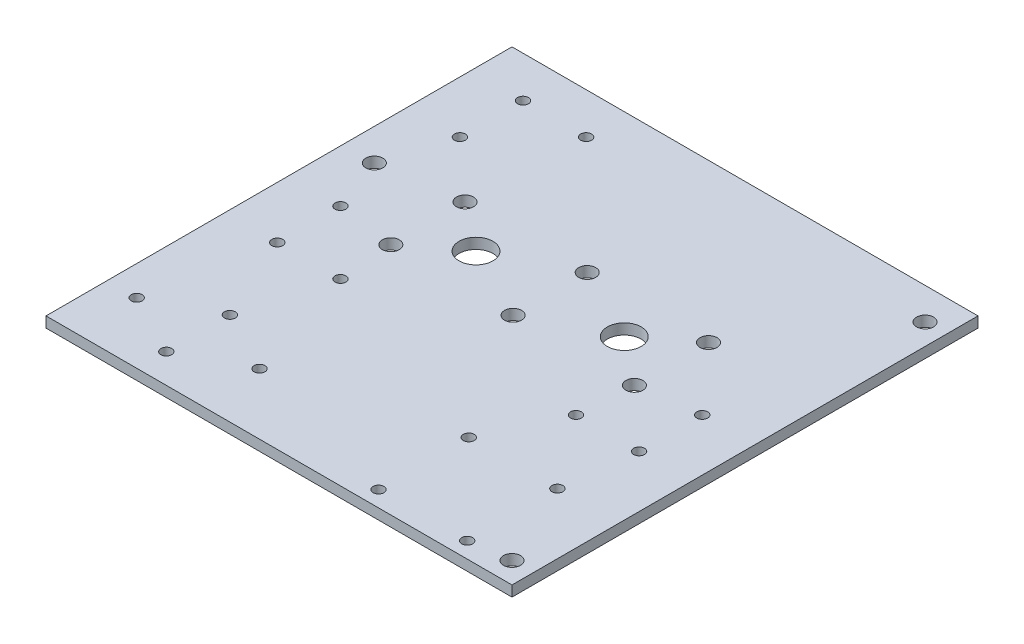
ISO-10303-21;
HEADER;
FILE_DESCRIPTION(('STEP AP214'),'2;1');
FILE_NAME('part.step','',(''),(''),'','','');
FILE_SCHEMA(('AUTOMOTIVE_DESIGN { 1 0 10303 214 1 1 1 1 }'));
ENDSEC;
DATA;
#1=APPLICATION_CONTEXT('core data for automotive mechanical design processes');
#2=APPLICATION_PROTOCOL_DEFINITION('international standard','automotive_design',2000,#1);
#3=PRODUCT_CONTEXT('',#1,'mechanical');
#4=PRODUCT('Part','Part','',(#3));
#5=PRODUCT_RELATED_PRODUCT_CATEGORY('part','',(#4));
#6=PRODUCT_DEFINITION_FORMATION('','',#4);
#7=PRODUCT_DEFINITION_CONTEXT('part definition',#1,'design');
#8=PRODUCT_DEFINITION('design','',#6,#7);
#9=PRODUCT_DEFINITION_SHAPE('','',#8);
#10=(LENGTH_UNIT() NAMED_UNIT(*) SI_UNIT(.MILLI.,.METRE.));
#11=(NAMED_UNIT(*) PLANE_ANGLE_UNIT() SI_UNIT($,.RADIAN.));
#12=(NAMED_UNIT(*) SI_UNIT($,.STERADIAN.) SOLID_ANGLE_UNIT());
#13=UNCERTAINTY_MEASURE_WITH_UNIT(LENGTH_MEASURE(1.E-05),#10,'distance_accuracy_value','');
#14=(GEOMETRIC_REPRESENTATION_CONTEXT(3) GLOBAL_UNCERTAINTY_ASSIGNED_CONTEXT((#13)) GLOBAL_UNIT_ASSIGNED_CONTEXT((#10,
#11,#12)) REPRESENTATION_CONTEXT('',''));
#15=CARTESIAN_POINT('',(0.,0.,0.));
#16=DIRECTION('',(0.,0.,1.));
#17=DIRECTION('',(1.,0.,0.));
#18=AXIS2_PLACEMENT_3D('',#15,#16,#17);
#19=CARTESIAN_POINT('',(0.,3.175,0.));
#20=DIRECTION('',(0.,-1.,0.));
#21=DIRECTION('',(0.,0.,-1.));
#22=AXIS2_PLACEMENT_3D('',#19,#20,#21);
#23=PLANE('',#22);
#24=CARTESIAN_POINT('',(-35.306,3.175,-57.531));
#25=DIRECTION('',(0.,1.,0.));
#26=DIRECTION('',(0.,0.,1.));
#27=AXIS2_PLACEMENT_3D('',#24,#25,#26);
#28=CIRCLE('',#27,1.63195);
#29=CARTESIAN_POINT('',(-35.306,3.175,-55.89905));
#30=VERTEX_POINT('',#29);
#31=EDGE_CURVE('E507',#30,#30,#28,.T.);
#32=ORIENTED_EDGE('',*,*,#31,.F.);
#33=EDGE_LOOP('',(#32));
#34=FACE_BOUND('',#33,.T.);
#35=CARTESIAN_POINT('',(-54.229,3.175,-57.531));
#36=DIRECTION('',(0.,1.,0.));
#37=DIRECTION('',(0.,0.,1.));
#38=AXIS2_PLACEMENT_3D('',#35,#36,#37);
#39=CIRCLE('',#38,1.63195);
#40=CARTESIAN_POINT('',(-54.229,3.175,-55.89905));
#41=VERTEX_POINT('',#40);
#42=EDGE_CURVE('E509',#41,#41,#39,.T.);
#43=ORIENTED_EDGE('',*,*,#42,.F.);
#44=EDGE_LOOP('',(#43));
#45=FACE_BOUND('',#44,.T.);
#46=CARTESIAN_POINT('',(-54.229,3.175,-38.608));
#47=DIRECTION('',(0.,1.,0.));
#48=DIRECTION('',(0.,0.,1.));
#49=AXIS2_PLACEMENT_3D('',#46,#47,#48);
#50=CIRCLE('',#49,1.63195);
#51=CARTESIAN_POINT('',(-54.229,3.175,-36.97605));
#52=VERTEX_POINT('',#51);
#53=EDGE_CURVE('E517',#52,#52,#50,.T.);
#54=ORIENTED_EDGE('',*,*,#53,.F.);
#55=EDGE_LOOP('',(#54));
#56=FACE_BOUND('',#55,.T.);
#57=CARTESIAN_POINT('',(-54.229,3.175,-2.79400000000001));
#58=DIRECTION('',(0.,1.,0.));
#59=DIRECTION('',(0.,0.,1.));
#60=AXIS2_PLACEMENT_3D('',#57,#58,#59);
#61=CIRCLE('',#60,1.63195);
#62=CARTESIAN_POINT('',(-54.229,3.175,-1.16205000000001));
#63=VERTEX_POINT('',#62);
#64=EDGE_CURVE('E520',#63,#63,#61,.T.);
#65=ORIENTED_EDGE('',*,*,#64,.F.);
#66=EDGE_LOOP('',(#65));
#67=FACE_BOUND('',#66,.T.);
#68=CARTESIAN_POINT('',(-54.229,3.175,16.129));
#69=DIRECTION('',(0.,1.,0.));
#70=DIRECTION('',(0.,0.,1.));
#71=AXIS2_PLACEMENT_3D('',#68,#69,#70);
#72=CIRCLE('',#71,1.63195);
#73=CARTESIAN_POINT('',(-54.229,3.175,17.76095));
#74=VERTEX_POINT('',#73);
#75=EDGE_CURVE('E526',#74,#74,#72,.T.);
#76=ORIENTED_EDGE('',*,*,#75,.F.);
#77=EDGE_LOOP('',(#76));
#78=FACE_BOUND('',#77,.T.);
#79=CARTESIAN_POINT('',(-35.306,3.175,16.129));
#80=DIRECTION('',(0.,1.,0.));
#81=DIRECTION('',(0.,0.,1.));
#82=AXIS2_PLACEMENT_3D('',#79,#80,#81);
#83=CIRCLE('',#82,1.63195);
#84=CARTESIAN_POINT('',(-35.306,3.175,17.76095));
#85=VERTEX_POINT('',#84);
#86=EDGE_CURVE('E532',#85,#85,#83,.T.);
#87=ORIENTED_EDGE('',*,*,#86,.F.);
#88=EDGE_LOOP('',(#87));
#89=FACE_BOUND('',#88,.T.);
#90=CARTESIAN_POINT('',(35.306,3.175,16.129));
#91=DIRECTION('',(0.,1.,0.));
#92=DIRECTION('',(0.,0.,1.));
#93=AXIS2_PLACEMENT_3D('',#90,#91,#92);
#94=CIRCLE('',#93,1.63195);
#95=CARTESIAN_POINT('',(35.306,3.175,17.76095));
#96=VERTEX_POINT('',#95);
#97=EDGE_CURVE('E538',#96,#96,#94,.T.);
#98=ORIENTED_EDGE('',*,*,#97,.F.);
#99=EDGE_LOOP('',(#98));
#100=FACE_BOUND('',#99,.T.);
#101=CARTESIAN_POINT('',(54.229,3.175,16.129));
#102=DIRECTION('',(0.,1.,0.));
#103=DIRECTION('',(0.,0.,1.));
#104=AXIS2_PLACEMENT_3D('',#101,#102,#103);
#105=CIRCLE('',#104,1.63195);
#106=CARTESIAN_POINT('',(54.229,3.175,17.76095));
#107=VERTEX_POINT('',#106);
#108=EDGE_CURVE('E544',#107,#107,#105,.T.);
#109=ORIENTED_EDGE('',*,*,#108,.F.);
#110=EDGE_LOOP('',(#109));
#111=FACE_BOUND('',#110,.T.);
#112=CARTESIAN_POINT('',(54.229,3.175,-2.79400000000001));
#113=DIRECTION('',(0.,1.,0.));
#114=DIRECTION('',(0.,0.,1.));
#115=AXIS2_PLACEMENT_3D('',#112,#113,#114);
#116=CIRCLE('',#115,1.63195);
#117=CARTESIAN_POINT('',(54.229,3.175,-1.16205000000001));
#118=VERTEX_POINT('',#117);
#119=EDGE_CURVE('E550',#118,#118,#116,.T.);
#120=ORIENTED_EDGE('',*,*,#119,.F.);
#121=EDGE_LOOP('',(#120));
#122=FACE_BOUND('',#121,.T.);
#123=CARTESIAN_POINT('',(-36.6395,3.175,-22.5425));
#124=DIRECTION('',(0.,1.,0.));
#125=DIRECTION('',(0.,0.,1.));
#126=AXIS2_PLACEMENT_3D('',#123,#124,#125);
#127=CIRCLE('',#126,2.5527);
#128=CARTESIAN_POINT('',(-36.6395,3.175,-19.9898));
#129=VERTEX_POINT('',#128);
#130=EDGE_CURVE('E556',#129,#129,#127,.T.);
#131=ORIENTED_EDGE('',*,*,#130,.F.);
#132=EDGE_LOOP('',(#131));
#133=FACE_BOUND('',#132,.T.);
#134=CARTESIAN_POINT('',(36.3855,3.175,-22.5425));
#135=DIRECTION('',(0.,1.,0.));
#136=DIRECTION('',(0.,0.,1.));
#137=AXIS2_PLACEMENT_3D('',#134,#135,#136);
#138=CIRCLE('',#137,2.5527);
#139=CARTESIAN_POINT('',(36.3855,3.175,-19.9898));
#140=VERTEX_POINT('',#139);
#141=EDGE_CURVE('E562',#140,#140,#138,.T.);
#142=ORIENTED_EDGE('',*,*,#141,.F.);
#143=EDGE_LOOP('',(#142));
#144=FACE_BOUND('',#143,.T.);
#145=CARTESIAN_POINT('',(36.3855,3.175,-0.317499999999998));
#146=DIRECTION('',(0.,1.,0.));
#147=DIRECTION('',(0.,0.,1.));
#148=AXIS2_PLACEMENT_3D('',#145,#146,#147);
#149=CIRCLE('',#148,2.5527);
#150=CARTESIAN_POINT('',(36.3855,3.175,2.2352));
#151=VERTEX_POINT('',#150);
#152=EDGE_CURVE('E568',#151,#151,#149,.T.);
#153=ORIENTED_EDGE('',*,*,#152,.F.);
#154=EDGE_LOOP('',(#153));
#155=FACE_BOUND('',#154,.T.);
#156=CARTESIAN_POINT('',(-36.6395,3.175,-0.317499999999998));
#157=DIRECTION('',(0.,1.,0.));
#158=DIRECTION('',(0.,0.,1.));
#159=AXIS2_PLACEMENT_3D('',#156,#157,#158);
#160=CIRCLE('',#159,2.5527);
#161=CARTESIAN_POINT('',(-36.6395,3.175,2.2352));
#162=VERTEX_POINT('',#161);
#163=EDGE_CURVE('E574',#162,#162,#160,.T.);
#164=ORIENTED_EDGE('',*,*,#163,.F.);
#165=EDGE_LOOP('',(#164));
#166=FACE_BOUND('',#165,.T.);
#167=CARTESIAN_POINT('',(0.,3.175,-0.317499999999998));
#168=DIRECTION('',(0.,1.,0.));
#169=DIRECTION('',(0.,0.,1.));
#170=AXIS2_PLACEMENT_3D('',#167,#168,#169);
#171=CIRCLE('',#170,2.5527);
#172=CARTESIAN_POINT('',(0.,3.175,2.2352));
#173=VERTEX_POINT('',#172);
#174=EDGE_CURVE('E580',#173,#173,#171,.T.);
#175=ORIENTED_EDGE('',*,*,#174,.F.);
#176=EDGE_LOOP('',(#175));
#177=FACE_BOUND('',#176,.T.);
#178=CARTESIAN_POINT('',(0.,3.175,-22.5425));
#179=DIRECTION('',(0.,1.,0.));
#180=DIRECTION('',(0.,0.,1.));
#181=AXIS2_PLACEMENT_3D('',#178,#179,#180);
#182=CIRCLE('',#181,2.5527);
#183=CARTESIAN_POINT('',(0.,3.175,-19.9898));
#184=VERTEX_POINT('',#183);
#185=EDGE_CURVE('E142',#184,#184,#182,.T.);
#186=ORIENTED_EDGE('',*,*,#185,.F.);
#187=EDGE_LOOP('',(#186));
#188=FACE_BOUND('',#187,.T.);
#189=CARTESIAN_POINT('',(25.0825,3.175,38.0365));
#190=DIRECTION('',(0.,1.,0.));
#191=DIRECTION('',(0.,0.,1.));
#192=AXIS2_PLACEMENT_3D('',#189,#190,#191);
#193=CIRCLE('',#192,1.63195);
#194=CARTESIAN_POINT('',(25.0825,3.175,39.66845));
#195=VERTEX_POINT('',#194);
#196=EDGE_CURVE('E130',#195,#195,#193,.T.);
#197=ORIENTED_EDGE('',*,*,#196,.F.);
#198=EDGE_LOOP('',(#197));
#199=FACE_BOUND('',#198,.T.);
#200=CARTESIAN_POINT('',(51.6509,3.175,38.0365));
#201=DIRECTION('',(0.,1.,0.));
#202=DIRECTION('',(0.,0.,1.));
#203=AXIS2_PLACEMENT_3D('',#200,#201,#202);
#204=CIRCLE('',#203,1.63195);
#205=CARTESIAN_POINT('',(51.6509,3.175,39.66845));
#206=VERTEX_POINT('',#205);
#207=EDGE_CURVE('E129',#206,#206,#204,.T.);
#208=ORIENTED_EDGE('',*,*,#207,.F.);
#209=EDGE_LOOP('',(#208));
#210=FACE_BOUND('',#209,.T.);
#211=CARTESIAN_POINT('',(25.0825,3.175,65.0875));
#212=DIRECTION('',(0.,1.,0.));
#213=DIRECTION('',(0.,0.,1.));
#214=AXIS2_PLACEMENT_3D('',#211,#212,#213);
#215=CIRCLE('',#214,1.63195);
#216=CARTESIAN_POINT('',(25.0825,3.175,66.71945));
#217=VERTEX_POINT('',#216);
#218=EDGE_CURVE('E126',#217,#217,#215,.T.);
#219=ORIENTED_EDGE('',*,*,#218,.F.);
#220=EDGE_LOOP('',(#219));
#221=FACE_BOUND('',#220,.T.);
#222=CARTESIAN_POINT('',(51.6509,3.175,65.0875));
#223=DIRECTION('',(0.,1.,0.));
#224=DIRECTION('',(0.,0.,1.));
#225=AXIS2_PLACEMENT_3D('',#222,#223,#224);
#226=CIRCLE('',#225,1.63195);
#227=CARTESIAN_POINT('',(51.6509,3.175,66.71945));
#228=VERTEX_POINT('',#227);
#229=EDGE_CURVE('E125',#228,#228,#226,.T.);
#230=ORIENTED_EDGE('',*,*,#229,.F.);
#231=EDGE_LOOP('',(#230));
#232=FACE_BOUND('',#231,.T.);
#233=CARTESIAN_POINT('',(-42.545,3.175,42.037));
#234=DIRECTION('',(0.,1.,0.));
#235=DIRECTION('',(0.,0.,1.));
#236=AXIS2_PLACEMENT_3D('',#233,#234,#235);
#237=CIRCLE('',#236,1.63195);
#238=CARTESIAN_POINT('',(-42.545,3.175,43.66895));
#239=VERTEX_POINT('',#238);
#240=EDGE_CURVE('E121',#239,#239,#237,.T.);
#241=ORIENTED_EDGE('',*,*,#240,.F.);
#242=EDGE_LOOP('',(#241));
#243=FACE_BOUND('',#242,.T.);
#244=CARTESIAN_POINT('',(-24.13,3.175,51.562));
#245=DIRECTION('',(0.,1.,0.));
#246=DIRECTION('',(0.,0.,1.));
#247=AXIS2_PLACEMENT_3D('',#244,#245,#246);
#248=CIRCLE('',#247,1.63195);
#249=CARTESIAN_POINT('',(-24.13,3.175,53.19395));
#250=VERTEX_POINT('',#249);
#251=EDGE_CURVE('E117',#250,#250,#248,.T.);
#252=ORIENTED_EDGE('',*,*,#251,.F.);
#253=EDGE_LOOP('',(#252));
#254=FACE_BOUND('',#253,.T.);
#255=CARTESIAN_POINT('',(-42.545,3.175,61.087));
#256=DIRECTION('',(0.,1.,0.));
#257=DIRECTION('',(0.,0.,1.));
#258=AXIS2_PLACEMENT_3D('',#255,#256,#257);
#259=CIRCLE('',#258,1.63195);
#260=CARTESIAN_POINT('',(-42.545,3.175,62.71895));
#261=VERTEX_POINT('',#260);
#262=EDGE_CURVE('E116',#261,#261,#259,.T.);
#263=ORIENTED_EDGE('',*,*,#262,.F.);
#264=EDGE_LOOP('',(#263));
#265=FACE_BOUND('',#264,.T.);
#266=CARTESIAN_POINT('',(63.5,3.175,63.5));
#267=DIRECTION('',(0.,1.,0.));
#268=DIRECTION('',(0.,0.,1.));
#269=AXIS2_PLACEMENT_3D('',#266,#267,#268);
#270=CIRCLE('',#269,2.55269999999999);
#271=CARTESIAN_POINT('',(63.5,3.175,66.0527));
#272=VERTEX_POINT('',#271);
#273=EDGE_CURVE('E169',#272,#272,#270,.T.);
#274=ORIENTED_EDGE('',*,*,#273,.F.);
#275=EDGE_LOOP('',(#274));
#276=FACE_BOUND('',#275,.T.);
#277=CARTESIAN_POINT('',(-60.325,3.175,-19.05));
#278=DIRECTION('',(0.,1.,0.));
#279=DIRECTION('',(0.,0.,1.));
#280=AXIS2_PLACEMENT_3D('',#277,#278,#279);
#281=CIRCLE('',#280,2.55269999999998);
#282=CARTESIAN_POINT('',(-60.325,3.175,-16.4973));
#283=VERTEX_POINT('',#282);
#284=EDGE_CURVE('E175',#283,#283,#281,.T.);
#285=ORIENTED_EDGE('',*,*,#284,.F.);
#286=EDGE_LOOP('',(#285));
#287=FACE_BOUND('',#286,.T.);
#288=CARTESIAN_POINT('',(63.5,3.175,-60.325));
#289=DIRECTION('',(0.,1.,0.));
#290=DIRECTION('',(0.,0.,1.));
#291=AXIS2_PLACEMENT_3D('',#288,#289,#290);
#292=CIRCLE('',#291,2.55269999999999);
#293=CARTESIAN_POINT('',(63.5,3.175,-57.7723));
#294=VERTEX_POINT('',#293);
#295=EDGE_CURVE('E181',#294,#294,#292,.T.);
#296=ORIENTED_EDGE('',*,*,#295,.F.);
#297=EDGE_LOOP('',(#296));
#298=FACE_BOUND('',#297,.T.);
#299=CARTESIAN_POINT('',(22.225,3.175,-11.43));
#300=DIRECTION('',(0.,1.,0.));
#301=DIRECTION('',(0.,0.,1.));
#302=AXIS2_PLACEMENT_3D('',#299,#300,#301);
#303=CIRCLE('',#302,5.08);
#304=CARTESIAN_POINT('',(22.225,3.175,-6.35));
#305=VERTEX_POINT('',#304);
#306=EDGE_CURVE('E187',#305,#305,#303,.T.);
#307=ORIENTED_EDGE('',*,*,#306,.F.);
#308=EDGE_LOOP('',(#307));
#309=FACE_BOUND('',#308,.T.);
#310=CARTESIAN_POINT('',(-22.225,3.175,-11.43));
#311=DIRECTION('',(0.,1.,0.));
#312=DIRECTION('',(0.,0.,1.));
#313=AXIS2_PLACEMENT_3D('',#310,#311,#312);
#314=CIRCLE('',#313,5.08);
#315=CARTESIAN_POINT('',(-22.225,3.175,-6.34999999999999));
#316=VERTEX_POINT('',#315);
#317=EDGE_CURVE('E191',#316,#316,#314,.T.);
#318=ORIENTED_EDGE('',*,*,#317,.F.);
#319=EDGE_LOOP('',(#318));
#320=FACE_BOUND('',#319,.T.);
#321=DIRECTION('',(0.,0.,-1.));
#322=VECTOR('',#321,1.);
#323=CARTESIAN_POINT('',(-69.85,3.175,69.85));
#324=LINE('',#323,#322);
#325=CARTESIAN_POINT('',(-69.85,3.175,69.85));
#326=VERTEX_POINT('',#325);
#327=CARTESIAN_POINT('',(-69.85,3.175,-69.85));
#328=VERTEX_POINT('',#327);
#329=EDGE_CURVE('E97',#326,#328,#324,.T.);
#330=ORIENTED_EDGE('',*,*,#329,.F.);
#331=DIRECTION('',(1.,0.,0.));
#332=VECTOR('',#331,1.);
#333=CARTESIAN_POINT('',(-69.85,3.175,69.85));
#334=LINE('',#333,#332);
#335=CARTESIAN_POINT('',(69.85,3.175,69.85));
#336=VERTEX_POINT('',#335);
#337=EDGE_CURVE('E86',#326,#336,#334,.T.);
#338=ORIENTED_EDGE('',*,*,#337,.T.);
#339=DIRECTION('',(0.,0.,-1.));
#340=VECTOR('',#339,1.);
#341=CARTESIAN_POINT('',(69.85,3.175,69.85));
#342=LINE('',#341,#340);
#343=CARTESIAN_POINT('',(69.85,3.175,-69.85));
#344=VERTEX_POINT('',#343);
#345=EDGE_CURVE('E81',#336,#344,#342,.T.);
#346=ORIENTED_EDGE('',*,*,#345,.T.);
#347=DIRECTION('',(1.,0.,0.));
#348=VECTOR('',#347,1.);
#349=CARTESIAN_POINT('',(-69.85,3.175,-69.85));
#350=LINE('',#349,#348);
#351=EDGE_CURVE('E85',#328,#344,#350,.T.);
#352=ORIENTED_EDGE('',*,*,#351,.F.);
#353=EDGE_LOOP('',(#330,#338,#346,#352));
#354=FACE_BOUND('',#353,.T.);
#355=CARTESIAN_POINT('',(-60.96,3.175,51.562));
#356=DIRECTION('',(0.,1.,0.));
#357=DIRECTION('',(0.,0.,1.));
#358=AXIS2_PLACEMENT_3D('',#355,#356,#357);
#359=CIRCLE('',#358,1.63195);
#360=CARTESIAN_POINT('',(-60.96,3.175,53.19395));
#361=VERTEX_POINT('',#360);
#362=EDGE_CURVE('E122',#361,#361,#359,.T.);
#363=ORIENTED_EDGE('',*,*,#362,.F.);
#364=EDGE_LOOP('',(#363));
#365=FACE_BOUND('',#364,.T.);
#366=ADVANCED_FACE('F34',(#34,#45,#56,#67,#78,#89,#100,#111,#122,#133,#144,#155,#166,#177,#188,
#199,#210,#221,#232,#243,#254,#265,#276,#287,#298,#309,#320,#354,#365),#23,.F.);
#367=CARTESIAN_POINT('',(-69.85,3.175,69.85));
#368=DIRECTION('',(-1.,0.,0.));
#369=DIRECTION('',(0.,0.,1.));
#370=AXIS2_PLACEMENT_3D('',#367,#368,#369);
#371=PLANE('',#370);
#372=DIRECTION('',(0.,0.,-1.));
#373=VECTOR('',#372,1.);
#374=CARTESIAN_POINT('',(-69.85,0.,69.85));
#375=LINE('',#374,#373);
#376=CARTESIAN_POINT('',(-69.85,0.,69.85));
#377=VERTEX_POINT('',#376);
#378=CARTESIAN_POINT('',(-69.85,0.,-69.85));
#379=VERTEX_POINT('',#378);
#380=EDGE_CURVE('E103',#377,#379,#375,.T.);
#381=ORIENTED_EDGE('',*,*,#380,.F.);
#382=DIRECTION('',(0.,-1.,0.));
#383=VECTOR('',#382,1.);
#384=CARTESIAN_POINT('',(-69.85,3.175,69.85));
#385=LINE('',#384,#383);
#386=EDGE_CURVE('E11',#326,#377,#385,.T.);
#387=ORIENTED_EDGE('',*,*,#386,.F.);
#388=ORIENTED_EDGE('',*,*,#329,.T.);
#389=DIRECTION('',(0.,-1.,0.));
#390=VECTOR('',#389,1.);
#391=CARTESIAN_POINT('',(-69.85,3.175,-69.85));
#392=LINE('',#391,#390);
#393=EDGE_CURVE('E76',#328,#379,#392,.T.);
#394=ORIENTED_EDGE('',*,*,#393,.T.);
#395=EDGE_LOOP('',(#381,#387,#388,#394));
#396=FACE_BOUND('',#395,.T.);
#397=ADVANCED_FACE('F36',(#396),#371,.T.);
#398=CARTESIAN_POINT('',(-69.85,3.175,69.85));
#399=DIRECTION('',(0.,0.,-1.));
#400=DIRECTION('',(-1.,0.,0.));
#401=AXIS2_PLACEMENT_3D('',#398,#399,#400);
#402=PLANE('',#401);
#403=DIRECTION('',(1.,0.,0.));
#404=VECTOR('',#403,1.);
#405=CARTESIAN_POINT('',(-69.85,0.,69.85));
#406=LINE('',#405,#404);
#407=CARTESIAN_POINT('',(69.85,0.,69.85));
#408=VERTEX_POINT('',#407);
#409=EDGE_CURVE('E68',#377,#408,#406,.T.);
#410=ORIENTED_EDGE('',*,*,#409,.T.);
#411=DIRECTION('',(0.,-1.,0.));
#412=VECTOR('',#411,1.);
#413=CARTESIAN_POINT('',(69.85,3.175,69.85));
#414=LINE('',#413,#412);
#415=EDGE_CURVE('E44',#336,#408,#414,.T.);
#416=ORIENTED_EDGE('',*,*,#415,.F.);
#417=ORIENTED_EDGE('',*,*,#337,.F.);
#418=ORIENTED_EDGE('',*,*,#386,.T.);
#419=EDGE_LOOP('',(#410,#416,#417,#418));
#420=FACE_BOUND('',#419,.T.);
#421=ADVANCED_FACE('F208',(#420),#402,.F.);
#422=CARTESIAN_POINT('',(69.85,3.175,69.85));
#423=DIRECTION('',(-1.,0.,0.));
#424=DIRECTION('',(0.,0.,1.));
#425=AXIS2_PLACEMENT_3D('',#422,#423,#424);
#426=PLANE('',#425);
#427=DIRECTION('',(0.,0.,-1.));
#428=VECTOR('',#427,1.);
#429=CARTESIAN_POINT('',(69.85,0.,69.85));
#430=LINE('',#429,#428);
#431=CARTESIAN_POINT('',(69.85,0.,-69.85));
#432=VERTEX_POINT('',#431);
#433=EDGE_CURVE('E93',#408,#432,#430,.T.);
#434=ORIENTED_EDGE('',*,*,#433,.T.);
#435=DIRECTION('',(0.,-1.,0.));
#436=VECTOR('',#435,1.);
#437=CARTESIAN_POINT('',(69.85,3.175,-69.85));
#438=LINE('',#437,#436);
#439=EDGE_CURVE('E90',#344,#432,#438,.T.);
#440=ORIENTED_EDGE('',*,*,#439,.F.);
#441=ORIENTED_EDGE('',*,*,#345,.F.);
#442=ORIENTED_EDGE('',*,*,#415,.T.);
#443=EDGE_LOOP('',(#434,#440,#441,#442));
#444=FACE_BOUND('',#443,.T.);
#445=ADVANCED_FACE('F91',(#444),#426,.F.);
#446=CARTESIAN_POINT('',(-69.85,3.175,-69.85));
#447=DIRECTION('',(0.,0.,-1.));
#448=DIRECTION('',(-1.,0.,0.));
#449=AXIS2_PLACEMENT_3D('',#446,#447,#448);
#450=PLANE('',#449);
#451=DIRECTION('',(1.,0.,0.));
#452=VECTOR('',#451,1.);
#453=CARTESIAN_POINT('',(-69.85,0.,-69.85));
#454=LINE('',#453,#452);
#455=EDGE_CURVE('E106',#379,#432,#454,.T.);
#456=ORIENTED_EDGE('',*,*,#455,.F.);
#457=ORIENTED_EDGE('',*,*,#393,.F.);
#458=ORIENTED_EDGE('',*,*,#351,.T.);
#459=ORIENTED_EDGE('',*,*,#439,.T.);
#460=EDGE_LOOP('',(#456,#457,#458,#459));
#461=FACE_BOUND('',#460,.T.);
#462=ADVANCED_FACE('F96',(#461),#450,.T.);
#463=CARTESIAN_POINT('',(0.,0.,0.));
#464=DIRECTION('',(0.,-1.,0.));
#465=DIRECTION('',(0.,0.,-1.));
#466=AXIS2_PLACEMENT_3D('',#463,#464,#465);
#467=PLANE('',#466);
#468=CARTESIAN_POINT('',(-35.306,0.,-57.531));
#469=DIRECTION('',(0.,-1.,0.));
#470=DIRECTION('',(0.,0.,-1.));
#471=AXIS2_PLACEMENT_3D('',#468,#469,#470);
#472=CIRCLE('',#471,1.63195);
#473=CARTESIAN_POINT('',(-35.306,0.,-59.16295));
#474=VERTEX_POINT('',#473);
#475=EDGE_CURVE('E505',#474,#474,#472,.T.);
#476=ORIENTED_EDGE('',*,*,#475,.F.);
#477=EDGE_LOOP('',(#476));
#478=FACE_BOUND('',#477,.T.);
#479=CARTESIAN_POINT('',(-54.229,0.,-57.531));
#480=DIRECTION('',(0.,-1.,0.));
#481=DIRECTION('',(0.,0.,-1.));
#482=AXIS2_PLACEMENT_3D('',#479,#480,#481);
#483=CIRCLE('',#482,1.63195);
#484=CARTESIAN_POINT('',(-54.229,0.,-59.16295));
#485=VERTEX_POINT('',#484);
#486=EDGE_CURVE('E514',#485,#485,#483,.T.);
#487=ORIENTED_EDGE('',*,*,#486,.F.);
#488=EDGE_LOOP('',(#487));
#489=FACE_BOUND('',#488,.T.);
#490=CARTESIAN_POINT('',(-54.229,0.,-38.608));
#491=DIRECTION('',(0.,-1.,0.));
#492=DIRECTION('',(0.,0.,-1.));
#493=AXIS2_PLACEMENT_3D('',#490,#491,#492);
#494=CIRCLE('',#493,1.63195);
#495=CARTESIAN_POINT('',(-54.229,0.,-40.23995));
#496=VERTEX_POINT('',#495);
#497=EDGE_CURVE('E38',#496,#496,#494,.T.);
#498=ORIENTED_EDGE('',*,*,#497,.F.);
#499=EDGE_LOOP('',(#498));
#500=FACE_BOUND('',#499,.T.);
#501=CARTESIAN_POINT('',(-54.229,0.,-2.79400000000001));
#502=DIRECTION('',(0.,-1.,0.));
#503=DIRECTION('',(0.,0.,-1.));
#504=AXIS2_PLACEMENT_3D('',#501,#502,#503);
#505=CIRCLE('',#504,1.63195);
#506=CARTESIAN_POINT('',(-54.229,0.,-4.42595000000001));
#507=VERTEX_POINT('',#506);
#508=EDGE_CURVE('E523',#507,#507,#505,.T.);
#509=ORIENTED_EDGE('',*,*,#508,.F.);
#510=EDGE_LOOP('',(#509));
#511=FACE_BOUND('',#510,.T.);
#512=CARTESIAN_POINT('',(-54.229,0.,16.129));
#513=DIRECTION('',(0.,-1.,0.));
#514=DIRECTION('',(0.,0.,-1.));
#515=AXIS2_PLACEMENT_3D('',#512,#513,#514);
#516=CIRCLE('',#515,1.63195);
#517=CARTESIAN_POINT('',(-54.229,0.,14.49705));
#518=VERTEX_POINT('',#517);
#519=EDGE_CURVE('E529',#518,#518,#516,.T.);
#520=ORIENTED_EDGE('',*,*,#519,.F.);
#521=EDGE_LOOP('',(#520));
#522=FACE_BOUND('',#521,.T.);
#523=CARTESIAN_POINT('',(-35.306,0.,16.129));
#524=DIRECTION('',(0.,-1.,0.));
#525=DIRECTION('',(0.,0.,-1.));
#526=AXIS2_PLACEMENT_3D('',#523,#524,#525);
#527=CIRCLE('',#526,1.63195);
#528=CARTESIAN_POINT('',(-35.306,0.,14.49705));
#529=VERTEX_POINT('',#528);
#530=EDGE_CURVE('E535',#529,#529,#527,.T.);
#531=ORIENTED_EDGE('',*,*,#530,.F.);
#532=EDGE_LOOP('',(#531));
#533=FACE_BOUND('',#532,.T.);
#534=CARTESIAN_POINT('',(35.306,0.,16.129));
#535=DIRECTION('',(0.,-1.,0.));
#536=DIRECTION('',(0.,0.,-1.));
#537=AXIS2_PLACEMENT_3D('',#534,#535,#536);
#538=CIRCLE('',#537,1.63195);
#539=CARTESIAN_POINT('',(35.306,0.,14.49705));
#540=VERTEX_POINT('',#539);
#541=EDGE_CURVE('E541',#540,#540,#538,.T.);
#542=ORIENTED_EDGE('',*,*,#541,.F.);
#543=EDGE_LOOP('',(#542));
#544=FACE_BOUND('',#543,.T.);
#545=CARTESIAN_POINT('',(54.229,0.,16.129));
#546=DIRECTION('',(0.,-1.,0.));
#547=DIRECTION('',(0.,0.,-1.));
#548=AXIS2_PLACEMENT_3D('',#545,#546,#547);
#549=CIRCLE('',#548,1.63195);
#550=CARTESIAN_POINT('',(54.229,0.,14.49705));
#551=VERTEX_POINT('',#550);
#552=EDGE_CURVE('E547',#551,#551,#549,.T.);
#553=ORIENTED_EDGE('',*,*,#552,.F.);
#554=EDGE_LOOP('',(#553));
#555=FACE_BOUND('',#554,.T.);
#556=CARTESIAN_POINT('',(54.229,0.,-2.79400000000001));
#557=DIRECTION('',(0.,-1.,0.));
#558=DIRECTION('',(0.,0.,-1.));
#559=AXIS2_PLACEMENT_3D('',#556,#557,#558);
#560=CIRCLE('',#559,1.63195);
#561=CARTESIAN_POINT('',(54.229,0.,-4.42595000000001));
#562=VERTEX_POINT('',#561);
#563=EDGE_CURVE('E553',#562,#562,#560,.T.);
#564=ORIENTED_EDGE('',*,*,#563,.F.);
#565=EDGE_LOOP('',(#564));
#566=FACE_BOUND('',#565,.T.);
#567=CARTESIAN_POINT('',(-36.6395,0.,-22.5425));
#568=DIRECTION('',(0.,-1.,0.));
#569=DIRECTION('',(0.,0.,-1.));
#570=AXIS2_PLACEMENT_3D('',#567,#568,#569);
#571=CIRCLE('',#570,2.5527);
#572=CARTESIAN_POINT('',(-36.6395,0.,-25.0952));
#573=VERTEX_POINT('',#572);
#574=EDGE_CURVE('E559',#573,#573,#571,.T.);
#575=ORIENTED_EDGE('',*,*,#574,.F.);
#576=EDGE_LOOP('',(#575));
#577=FACE_BOUND('',#576,.T.);
#578=CARTESIAN_POINT('',(36.3855,0.,-22.5425));
#579=DIRECTION('',(0.,-1.,0.));
#580=DIRECTION('',(0.,0.,-1.));
#581=AXIS2_PLACEMENT_3D('',#578,#579,#580);
#582=CIRCLE('',#581,2.5527);
#583=CARTESIAN_POINT('',(36.3855,0.,-25.0952));
#584=VERTEX_POINT('',#583);
#585=EDGE_CURVE('E565',#584,#584,#582,.T.);
#586=ORIENTED_EDGE('',*,*,#585,.F.);
#587=EDGE_LOOP('',(#586));
#588=FACE_BOUND('',#587,.T.);
#589=CARTESIAN_POINT('',(36.3855,0.,-0.317499999999998));
#590=DIRECTION('',(0.,-1.,0.));
#591=DIRECTION('',(0.,0.,-1.));
#592=AXIS2_PLACEMENT_3D('',#589,#590,#591);
#593=CIRCLE('',#592,2.5527);
#594=CARTESIAN_POINT('',(36.3855,0.,-2.8702));
#595=VERTEX_POINT('',#594);
#596=EDGE_CURVE('E571',#595,#595,#593,.T.);
#597=ORIENTED_EDGE('',*,*,#596,.F.);
#598=EDGE_LOOP('',(#597));
#599=FACE_BOUND('',#598,.T.);
#600=CARTESIAN_POINT('',(-36.6395,0.,-0.317499999999998));
#601=DIRECTION('',(0.,-1.,0.));
#602=DIRECTION('',(0.,0.,-1.));
#603=AXIS2_PLACEMENT_3D('',#600,#601,#602);
#604=CIRCLE('',#603,2.5527);
#605=CARTESIAN_POINT('',(-36.6395,0.,-2.8702));
#606=VERTEX_POINT('',#605);
#607=EDGE_CURVE('E577',#606,#606,#604,.T.);
#608=ORIENTED_EDGE('',*,*,#607,.F.);
#609=EDGE_LOOP('',(#608));
#610=FACE_BOUND('',#609,.T.);
#611=CARTESIAN_POINT('',(0.,0.,-0.317499999999998));
#612=DIRECTION('',(0.,-1.,0.));
#613=DIRECTION('',(0.,0.,-1.));
#614=AXIS2_PLACEMENT_3D('',#611,#612,#613);
#615=CIRCLE('',#614,2.5527);
#616=CARTESIAN_POINT('',(0.,0.,-2.8702));
#617=VERTEX_POINT('',#616);
#618=EDGE_CURVE('E583',#617,#617,#615,.T.);
#619=ORIENTED_EDGE('',*,*,#618,.F.);
#620=EDGE_LOOP('',(#619));
#621=FACE_BOUND('',#620,.T.);
#622=CARTESIAN_POINT('',(0.,0.,-22.5425));
#623=DIRECTION('',(0.,-1.,0.));
#624=DIRECTION('',(0.,0.,-1.));
#625=AXIS2_PLACEMENT_3D('',#622,#623,#624);
#626=CIRCLE('',#625,2.5527);
#627=CARTESIAN_POINT('',(0.,0.,-25.0952));
#628=VERTEX_POINT('',#627);
#629=EDGE_CURVE('E137',#628,#628,#626,.T.);
#630=ORIENTED_EDGE('',*,*,#629,.F.);
#631=EDGE_LOOP('',(#630));
#632=FACE_BOUND('',#631,.T.);
#633=CARTESIAN_POINT('',(25.0825,0.,38.0365));
#634=DIRECTION('',(0.,-1.,0.));
#635=DIRECTION('',(0.,0.,-1.));
#636=AXIS2_PLACEMENT_3D('',#633,#634,#635);
#637=CIRCLE('',#636,1.63195);
#638=CARTESIAN_POINT('',(25.0825,0.,36.40455));
#639=VERTEX_POINT('',#638);
#640=EDGE_CURVE('E127',#639,#639,#637,.T.);
#641=ORIENTED_EDGE('',*,*,#640,.F.);
#642=EDGE_LOOP('',(#641));
#643=FACE_BOUND('',#642,.T.);
#644=CARTESIAN_POINT('',(51.6509,0.,38.0365));
#645=DIRECTION('',(0.,-1.,0.));
#646=DIRECTION('',(0.,0.,-1.));
#647=AXIS2_PLACEMENT_3D('',#644,#645,#646);
#648=CIRCLE('',#647,1.63195);
#649=CARTESIAN_POINT('',(51.6509,0.,36.40455));
#650=VERTEX_POINT('',#649);
#651=EDGE_CURVE('E134',#650,#650,#648,.T.);
#652=ORIENTED_EDGE('',*,*,#651,.F.);
#653=EDGE_LOOP('',(#652));
#654=FACE_BOUND('',#653,.T.);
#655=CARTESIAN_POINT('',(25.0825,0.,65.0875));
#656=DIRECTION('',(0.,-1.,0.));
#657=DIRECTION('',(0.,0.,-1.));
#658=AXIS2_PLACEMENT_3D('',#655,#656,#657);
#659=CIRCLE('',#658,1.63195);
#660=CARTESIAN_POINT('',(25.0825,0.,63.45555));
#661=VERTEX_POINT('',#660);
#662=EDGE_CURVE('E123',#661,#661,#659,.T.);
#663=ORIENTED_EDGE('',*,*,#662,.F.);
#664=EDGE_LOOP('',(#663));
#665=FACE_BOUND('',#664,.T.);
#666=CARTESIAN_POINT('',(51.6509,0.,65.0875));
#667=DIRECTION('',(0.,-1.,0.));
#668=DIRECTION('',(0.,0.,-1.));
#669=AXIS2_PLACEMENT_3D('',#666,#667,#668);
#670=CIRCLE('',#669,1.63195);
#671=CARTESIAN_POINT('',(51.6509,0.,63.45555));
#672=VERTEX_POINT('',#671);
#673=EDGE_CURVE('E152',#672,#672,#670,.T.);
#674=ORIENTED_EDGE('',*,*,#673,.F.);
#675=EDGE_LOOP('',(#674));
#676=FACE_BOUND('',#675,.T.);
#677=CARTESIAN_POINT('',(-60.96,0.,51.562));
#678=DIRECTION('',(0.,-1.,0.));
#679=DIRECTION('',(0.,0.,-1.));
#680=AXIS2_PLACEMENT_3D('',#677,#678,#679);
#681=CIRCLE('',#680,1.63195);
#682=CARTESIAN_POINT('',(-60.96,0.,49.93005));
#683=VERTEX_POINT('',#682);
#684=EDGE_CURVE('E118',#683,#683,#681,.T.);
#685=ORIENTED_EDGE('',*,*,#684,.F.);
#686=EDGE_LOOP('',(#685));
#687=FACE_BOUND('',#686,.T.);
#688=CARTESIAN_POINT('',(-42.545,0.,42.037));
#689=DIRECTION('',(0.,-1.,0.));
#690=DIRECTION('',(0.,0.,-1.));
#691=AXIS2_PLACEMENT_3D('',#688,#689,#690);
#692=CIRCLE('',#691,1.63195);
#693=CARTESIAN_POINT('',(-42.545,0.,40.40505));
#694=VERTEX_POINT('',#693);
#695=EDGE_CURVE('E159',#694,#694,#692,.T.);
#696=ORIENTED_EDGE('',*,*,#695,.F.);
#697=EDGE_LOOP('',(#696));
#698=FACE_BOUND('',#697,.T.);
#699=CARTESIAN_POINT('',(-24.13,0.,51.562));
#700=DIRECTION('',(0.,-1.,0.));
#701=DIRECTION('',(0.,0.,-1.));
#702=AXIS2_PLACEMENT_3D('',#699,#700,#701);
#703=CIRCLE('',#702,1.63195);
#704=CARTESIAN_POINT('',(-24.13,0.,49.93005));
#705=VERTEX_POINT('',#704);
#706=EDGE_CURVE('E113',#705,#705,#703,.T.);
#707=ORIENTED_EDGE('',*,*,#706,.F.);
#708=EDGE_LOOP('',(#707));
#709=FACE_BOUND('',#708,.T.);
#710=CARTESIAN_POINT('',(-42.545,0.,61.087));
#711=DIRECTION('',(0.,-1.,0.));
#712=DIRECTION('',(0.,0.,-1.));
#713=AXIS2_PLACEMENT_3D('',#710,#711,#712);
#714=CIRCLE('',#713,1.63195);
#715=CARTESIAN_POINT('',(-42.545,0.,59.45505));
#716=VERTEX_POINT('',#715);
#717=EDGE_CURVE('E166',#716,#716,#714,.T.);
#718=ORIENTED_EDGE('',*,*,#717,.F.);
#719=EDGE_LOOP('',(#718));
#720=FACE_BOUND('',#719,.T.);
#721=CARTESIAN_POINT('',(63.5,0.,63.5));
#722=DIRECTION('',(0.,-1.,0.));
#723=DIRECTION('',(0.,0.,-1.));
#724=AXIS2_PLACEMENT_3D('',#721,#722,#723);
#725=CIRCLE('',#724,2.5527);
#726=CARTESIAN_POINT('',(63.5,0.,60.9473));
#727=VERTEX_POINT('',#726);
#728=EDGE_CURVE('E172',#727,#727,#725,.T.);
#729=ORIENTED_EDGE('',*,*,#728,.F.);
#730=EDGE_LOOP('',(#729));
#731=FACE_BOUND('',#730,.T.);
#732=CARTESIAN_POINT('',(-60.325,0.,-19.05));
#733=DIRECTION('',(0.,-1.,0.));
#734=DIRECTION('',(0.,0.,-1.));
#735=AXIS2_PLACEMENT_3D('',#732,#733,#734);
#736=CIRCLE('',#735,2.55269999999999);
#737=CARTESIAN_POINT('',(-60.325,0.,-21.6027));
#738=VERTEX_POINT('',#737);
#739=EDGE_CURVE('E178',#738,#738,#736,.T.);
#740=ORIENTED_EDGE('',*,*,#739,.F.);
#741=EDGE_LOOP('',(#740));
#742=FACE_BOUND('',#741,.T.);
#743=CARTESIAN_POINT('',(63.5,0.,-60.325));
#744=DIRECTION('',(0.,-1.,0.));
#745=DIRECTION('',(0.,0.,-1.));
#746=AXIS2_PLACEMENT_3D('',#743,#744,#745);
#747=CIRCLE('',#746,2.5527);
#748=CARTESIAN_POINT('',(63.5,0.,-62.8777));
#749=VERTEX_POINT('',#748);
#750=EDGE_CURVE('E184',#749,#749,#747,.T.);
#751=ORIENTED_EDGE('',*,*,#750,.F.);
#752=EDGE_LOOP('',(#751));
#753=FACE_BOUND('',#752,.T.);
#754=CARTESIAN_POINT('',(22.225,0.,-11.43));
#755=DIRECTION('',(0.,1.,0.));
#756=DIRECTION('',(0.,0.,1.));
#757=AXIS2_PLACEMENT_3D('',#754,#755,#756);
#758=CIRCLE('',#757,5.08);
#759=CARTESIAN_POINT('',(22.225,0.,-6.35));
#760=VERTEX_POINT('',#759);
#761=EDGE_CURVE('E188',#760,#760,#758,.T.);
#762=ORIENTED_EDGE('',*,*,#761,.T.);
#763=EDGE_LOOP('',(#762));
#764=FACE_BOUND('',#763,.T.);
#765=CARTESIAN_POINT('',(-22.225,0.,-11.43));
#766=DIRECTION('',(0.,1.,0.));
#767=DIRECTION('',(0.,0.,1.));
#768=AXIS2_PLACEMENT_3D('',#765,#766,#767);
#769=CIRCLE('',#768,5.08);
#770=CARTESIAN_POINT('',(-22.225,0.,-6.34999999999999));
#771=VERTEX_POINT('',#770);
#772=EDGE_CURVE('E107',#771,#771,#769,.T.);
#773=ORIENTED_EDGE('',*,*,#772,.T.);
#774=EDGE_LOOP('',(#773));
#775=FACE_BOUND('',#774,.T.);
#776=ORIENTED_EDGE('',*,*,#380,.T.);
#777=ORIENTED_EDGE('',*,*,#455,.T.);
#778=ORIENTED_EDGE('',*,*,#433,.F.);
#779=ORIENTED_EDGE('',*,*,#409,.F.);
#780=EDGE_LOOP('',(#776,#777,#778,#779));
#781=FACE_BOUND('',#780,.T.);
#782=ADVANCED_FACE('F214',(#478,#489,#500,#511,#522,#533,#544,#555,#566,#577,#588,#599,#610,
#621,#632,#643,#654,#665,#676,#687,#698,#709,#720,#731,#742,#753,#764,#775,#781),#467,.T.);
#783=CARTESIAN_POINT('',(-22.225,0.,-11.43));
#784=DIRECTION('',(0.,1.,0.));
#785=DIRECTION('',(0.,0.,1.));
#786=AXIS2_PLACEMENT_3D('',#783,#784,#785);
#787=CYLINDRICAL_SURFACE('',#786,5.08);
#788=ORIENTED_EDGE('',*,*,#772,.F.);
#789=EDGE_LOOP('',(#788));
#790=FACE_BOUND('',#789,.T.);
#791=ORIENTED_EDGE('',*,*,#317,.T.);
#792=EDGE_LOOP('',(#791));
#793=FACE_BOUND('',#792,.T.);
#794=ADVANCED_FACE('F198',(#790,#793),#787,.F.);
#795=CARTESIAN_POINT('',(22.225,0.,-11.43));
#796=DIRECTION('',(0.,1.,0.));
#797=DIRECTION('',(0.,0.,1.));
#798=AXIS2_PLACEMENT_3D('',#795,#796,#797);
#799=CYLINDRICAL_SURFACE('',#798,5.08);
#800=ORIENTED_EDGE('',*,*,#761,.F.);
#801=EDGE_LOOP('',(#800));
#802=FACE_BOUND('',#801,.T.);
#803=ORIENTED_EDGE('',*,*,#306,.T.);
#804=EDGE_LOOP('',(#803));
#805=FACE_BOUND('',#804,.T.);
#806=ADVANCED_FACE('F245',(#802,#805),#799,.F.);
#807=CARTESIAN_POINT('',(63.5,3.175,-60.325));
#808=DIRECTION('',(0.,1.,0.));
#809=DIRECTION('',(0.,0.,1.));
#810=AXIS2_PLACEMENT_3D('',#807,#808,#809);
#811=CYLINDRICAL_SURFACE('',#810,2.5527);
#812=ORIENTED_EDGE('',*,*,#295,.T.);
#813=EDGE_LOOP('',(#812));
#814=FACE_BOUND('',#813,.T.);
#815=ORIENTED_EDGE('',*,*,#750,.T.);
#816=EDGE_LOOP('',(#815));
#817=FACE_BOUND('',#816,.T.);
#818=ADVANCED_FACE('F251',(#814,#817),#811,.F.);
#819=CARTESIAN_POINT('',(-60.325,3.175,-19.05));
#820=DIRECTION('',(0.,1.,0.));
#821=DIRECTION('',(0.,0.,1.));
#822=AXIS2_PLACEMENT_3D('',#819,#820,#821);
#823=CYLINDRICAL_SURFACE('',#822,2.55269999999999);
#824=ORIENTED_EDGE('',*,*,#284,.T.);
#825=EDGE_LOOP('',(#824));
#826=FACE_BOUND('',#825,.T.);
#827=ORIENTED_EDGE('',*,*,#739,.T.);
#828=EDGE_LOOP('',(#827));
#829=FACE_BOUND('',#828,.T.);
#830=ADVANCED_FACE('F258',(#826,#829),#823,.F.);
#831=CARTESIAN_POINT('',(63.5,3.175,63.5));
#832=DIRECTION('',(0.,1.,0.));
#833=DIRECTION('',(0.,0.,1.));
#834=AXIS2_PLACEMENT_3D('',#831,#832,#833);
#835=CYLINDRICAL_SURFACE('',#834,2.5527);
#836=ORIENTED_EDGE('',*,*,#273,.T.);
#837=EDGE_LOOP('',(#836));
#838=FACE_BOUND('',#837,.T.);
#839=ORIENTED_EDGE('',*,*,#728,.T.);
#840=EDGE_LOOP('',(#839));
#841=FACE_BOUND('',#840,.T.);
#842=ADVANCED_FACE('F266',(#838,#841),#835,.F.);
#843=CARTESIAN_POINT('',(-42.545,3.175,61.087));
#844=DIRECTION('',(0.,1.,0.));
#845=DIRECTION('',(0.,0.,1.));
#846=AXIS2_PLACEMENT_3D('',#843,#844,#845);
#847=CYLINDRICAL_SURFACE('',#846,1.63195);
#848=ORIENTED_EDGE('',*,*,#717,.T.);
#849=EDGE_LOOP('',(#848));
#850=FACE_BOUND('',#849,.T.);
#851=ORIENTED_EDGE('',*,*,#262,.T.);
#852=EDGE_LOOP('',(#851));
#853=FACE_BOUND('',#852,.T.);
#854=ADVANCED_FACE('F274',(#850,#853),#847,.F.);
#855=CARTESIAN_POINT('',(-24.13,3.175,51.562));
#856=DIRECTION('',(0.,1.,0.));
#857=DIRECTION('',(0.,0.,1.));
#858=AXIS2_PLACEMENT_3D('',#855,#856,#857);
#859=CYLINDRICAL_SURFACE('',#858,1.63195);
#860=ORIENTED_EDGE('',*,*,#706,.T.);
#861=EDGE_LOOP('',(#860));
#862=FACE_BOUND('',#861,.T.);
#863=ORIENTED_EDGE('',*,*,#251,.T.);
#864=EDGE_LOOP('',(#863));
#865=FACE_BOUND('',#864,.T.);
#866=ADVANCED_FACE('F281',(#862,#865),#859,.F.);
#867=CARTESIAN_POINT('',(-42.545,3.175,42.037));
#868=DIRECTION('',(0.,1.,0.));
#869=DIRECTION('',(0.,0.,1.));
#870=AXIS2_PLACEMENT_3D('',#867,#868,#869);
#871=CYLINDRICAL_SURFACE('',#870,1.63195);
#872=ORIENTED_EDGE('',*,*,#695,.T.);
#873=EDGE_LOOP('',(#872));
#874=FACE_BOUND('',#873,.T.);
#875=ORIENTED_EDGE('',*,*,#240,.T.);
#876=EDGE_LOOP('',(#875));
#877=FACE_BOUND('',#876,.T.);
#878=ADVANCED_FACE('F288',(#874,#877),#871,.F.);
#879=CARTESIAN_POINT('',(-60.96,3.175,51.562));
#880=DIRECTION('',(0.,1.,0.));
#881=DIRECTION('',(0.,0.,1.));
#882=AXIS2_PLACEMENT_3D('',#879,#880,#881);
#883=CYLINDRICAL_SURFACE('',#882,1.63195);
#884=ORIENTED_EDGE('',*,*,#684,.T.);
#885=EDGE_LOOP('',(#884));
#886=FACE_BOUND('',#885,.T.);
#887=ORIENTED_EDGE('',*,*,#362,.T.);
#888=EDGE_LOOP('',(#887));
#889=FACE_BOUND('',#888,.T.);
#890=ADVANCED_FACE('F296',(#886,#889),#883,.F.);
#891=CARTESIAN_POINT('',(51.6509,3.175,65.0875));
#892=DIRECTION('',(0.,1.,0.));
#893=DIRECTION('',(0.,0.,1.));
#894=AXIS2_PLACEMENT_3D('',#891,#892,#893);
#895=CYLINDRICAL_SURFACE('',#894,1.63195);
#896=ORIENTED_EDGE('',*,*,#673,.T.);
#897=EDGE_LOOP('',(#896));
#898=FACE_BOUND('',#897,.T.);
#899=ORIENTED_EDGE('',*,*,#229,.T.);
#900=EDGE_LOOP('',(#899));
#901=FACE_BOUND('',#900,.T.);
#902=ADVANCED_FACE('F304',(#898,#901),#895,.F.);
#903=CARTESIAN_POINT('',(25.0825,3.175,65.0875));
#904=DIRECTION('',(0.,1.,0.));
#905=DIRECTION('',(0.,0.,1.));
#906=AXIS2_PLACEMENT_3D('',#903,#904,#905);
#907=CYLINDRICAL_SURFACE('',#906,1.63195);
#908=ORIENTED_EDGE('',*,*,#662,.T.);
#909=EDGE_LOOP('',(#908));
#910=FACE_BOUND('',#909,.T.);
#911=ORIENTED_EDGE('',*,*,#218,.T.);
#912=EDGE_LOOP('',(#911));
#913=FACE_BOUND('',#912,.T.);
#914=ADVANCED_FACE('F312',(#910,#913),#907,.F.);
#915=CARTESIAN_POINT('',(51.6509,3.175,38.0365));
#916=DIRECTION('',(0.,1.,0.));
#917=DIRECTION('',(0.,0.,1.));
#918=AXIS2_PLACEMENT_3D('',#915,#916,#917);
#919=CYLINDRICAL_SURFACE('',#918,1.63195);
#920=ORIENTED_EDGE('',*,*,#651,.T.);
#921=EDGE_LOOP('',(#920));
#922=FACE_BOUND('',#921,.T.);
#923=ORIENTED_EDGE('',*,*,#207,.T.);
#924=EDGE_LOOP('',(#923));
#925=FACE_BOUND('',#924,.T.);
#926=ADVANCED_FACE('F320',(#922,#925),#919,.F.);
#927=CARTESIAN_POINT('',(25.0825,3.175,38.0365));
#928=DIRECTION('',(0.,1.,0.));
#929=DIRECTION('',(0.,0.,1.));
#930=AXIS2_PLACEMENT_3D('',#927,#928,#929);
#931=CYLINDRICAL_SURFACE('',#930,1.63195);
#932=ORIENTED_EDGE('',*,*,#640,.T.);
#933=EDGE_LOOP('',(#932));
#934=FACE_BOUND('',#933,.T.);
#935=ORIENTED_EDGE('',*,*,#196,.T.);
#936=EDGE_LOOP('',(#935));
#937=FACE_BOUND('',#936,.T.);
#938=ADVANCED_FACE('F328',(#934,#937),#931,.F.);
#939=CARTESIAN_POINT('',(0.,3.175,-22.5425));
#940=DIRECTION('',(0.,1.,0.));
#941=DIRECTION('',(0.,0.,1.));
#942=AXIS2_PLACEMENT_3D('',#939,#940,#941);
#943=CYLINDRICAL_SURFACE('',#942,2.5527);
#944=ORIENTED_EDGE('',*,*,#629,.T.);
#945=EDGE_LOOP('',(#944));
#946=FACE_BOUND('',#945,.T.);
#947=ORIENTED_EDGE('',*,*,#185,.T.);
#948=EDGE_LOOP('',(#947));
#949=FACE_BOUND('',#948,.T.);
#950=ADVANCED_FACE('F336',(#946,#949),#943,.F.);
#951=CARTESIAN_POINT('',(0.,3.175,-0.317499999999998));
#952=DIRECTION('',(0.,1.,0.));
#953=DIRECTION('',(0.,0.,1.));
#954=AXIS2_PLACEMENT_3D('',#951,#952,#953);
#955=CYLINDRICAL_SURFACE('',#954,2.5527);
#956=ORIENTED_EDGE('',*,*,#618,.T.);
#957=EDGE_LOOP('',(#956));
#958=FACE_BOUND('',#957,.T.);
#959=ORIENTED_EDGE('',*,*,#174,.T.);
#960=EDGE_LOOP('',(#959));
#961=FACE_BOUND('',#960,.T.);
#962=ADVANCED_FACE('F343',(#958,#961),#955,.F.);
#963=CARTESIAN_POINT('',(-36.6395,3.175,-0.317499999999998));
#964=DIRECTION('',(0.,1.,0.));
#965=DIRECTION('',(0.,0.,1.));
#966=AXIS2_PLACEMENT_3D('',#963,#964,#965);
#967=CYLINDRICAL_SURFACE('',#966,2.5527);
#968=ORIENTED_EDGE('',*,*,#607,.T.);
#969=EDGE_LOOP('',(#968));
#970=FACE_BOUND('',#969,.T.);
#971=ORIENTED_EDGE('',*,*,#163,.T.);
#972=EDGE_LOOP('',(#971));
#973=FACE_BOUND('',#972,.T.);
#974=ADVANCED_FACE('F351',(#970,#973),#967,.F.);
#975=CARTESIAN_POINT('',(36.3855,3.175,-0.317499999999998));
#976=DIRECTION('',(0.,1.,0.));
#977=DIRECTION('',(0.,0.,1.));
#978=AXIS2_PLACEMENT_3D('',#975,#976,#977);
#979=CYLINDRICAL_SURFACE('',#978,2.5527);
#980=ORIENTED_EDGE('',*,*,#596,.T.);
#981=EDGE_LOOP('',(#980));
#982=FACE_BOUND('',#981,.T.);
#983=ORIENTED_EDGE('',*,*,#152,.T.);
#984=EDGE_LOOP('',(#983));
#985=FACE_BOUND('',#984,.T.);
#986=ADVANCED_FACE('F359',(#982,#985),#979,.F.);
#987=CARTESIAN_POINT('',(36.3855,3.175,-22.5425));
#988=DIRECTION('',(0.,1.,0.));
#989=DIRECTION('',(0.,0.,1.));
#990=AXIS2_PLACEMENT_3D('',#987,#988,#989);
#991=CYLINDRICAL_SURFACE('',#990,2.5527);
#992=ORIENTED_EDGE('',*,*,#585,.T.);
#993=EDGE_LOOP('',(#992));
#994=FACE_BOUND('',#993,.T.);
#995=ORIENTED_EDGE('',*,*,#141,.T.);
#996=EDGE_LOOP('',(#995));
#997=FACE_BOUND('',#996,.T.);
#998=ADVANCED_FACE('F367',(#994,#997),#991,.F.);
#999=CARTESIAN_POINT('',(-36.6395,3.175,-22.5425));
#1000=DIRECTION('',(0.,1.,0.));
#1001=DIRECTION('',(0.,0.,1.));
#1002=AXIS2_PLACEMENT_3D('',#999,#1000,#1001);
#1003=CYLINDRICAL_SURFACE('',#1002,2.5527);
#1004=ORIENTED_EDGE('',*,*,#574,.T.);
#1005=EDGE_LOOP('',(#1004));
#1006=FACE_BOUND('',#1005,.T.);
#1007=ORIENTED_EDGE('',*,*,#130,.T.);
#1008=EDGE_LOOP('',(#1007));
#1009=FACE_BOUND('',#1008,.T.);
#1010=ADVANCED_FACE('F375',(#1006,#1009),#1003,.F.);
#1011=CARTESIAN_POINT('',(54.229,3.175,-2.79400000000001));
#1012=DIRECTION('',(0.,1.,0.));
#1013=DIRECTION('',(0.,0.,1.));
#1014=AXIS2_PLACEMENT_3D('',#1011,#1012,#1013);
#1015=CYLINDRICAL_SURFACE('',#1014,1.63195);
#1016=ORIENTED_EDGE('',*,*,#563,.T.);
#1017=EDGE_LOOP('',(#1016));
#1018=FACE_BOUND('',#1017,.T.);
#1019=ORIENTED_EDGE('',*,*,#119,.T.);
#1020=EDGE_LOOP('',(#1019));
#1021=FACE_BOUND('',#1020,.T.);
#1022=ADVANCED_FACE('F382',(#1018,#1021),#1015,.F.);
#1023=CARTESIAN_POINT('',(54.229,3.175,16.129));
#1024=DIRECTION('',(0.,1.,0.));
#1025=DIRECTION('',(0.,0.,1.));
#1026=AXIS2_PLACEMENT_3D('',#1023,#1024,#1025);
#1027=CYLINDRICAL_SURFACE('',#1026,1.63195);
#1028=ORIENTED_EDGE('',*,*,#552,.T.);
#1029=EDGE_LOOP('',(#1028));
#1030=FACE_BOUND('',#1029,.T.);
#1031=ORIENTED_EDGE('',*,*,#108,.T.);
#1032=EDGE_LOOP('',(#1031));
#1033=FACE_BOUND('',#1032,.T.);
#1034=ADVANCED_FACE('F389',(#1030,#1033),#1027,.F.);
#1035=CARTESIAN_POINT('',(35.306,3.175,16.129));
#1036=DIRECTION('',(0.,1.,0.));
#1037=DIRECTION('',(0.,0.,1.));
#1038=AXIS2_PLACEMENT_3D('',#1035,#1036,#1037);
#1039=CYLINDRICAL_SURFACE('',#1038,1.63195);
#1040=ORIENTED_EDGE('',*,*,#541,.T.);
#1041=EDGE_LOOP('',(#1040));
#1042=FACE_BOUND('',#1041,.T.);
#1043=ORIENTED_EDGE('',*,*,#97,.T.);
#1044=EDGE_LOOP('',(#1043));
#1045=FACE_BOUND('',#1044,.T.);
#1046=ADVANCED_FACE('F397',(#1042,#1045),#1039,.F.);
#1047=CARTESIAN_POINT('',(-35.306,3.175,16.129));
#1048=DIRECTION('',(0.,1.,0.));
#1049=DIRECTION('',(0.,0.,1.));
#1050=AXIS2_PLACEMENT_3D('',#1047,#1048,#1049);
#1051=CYLINDRICAL_SURFACE('',#1050,1.63195);
#1052=ORIENTED_EDGE('',*,*,#530,.T.);
#1053=EDGE_LOOP('',(#1052));
#1054=FACE_BOUND('',#1053,.T.);
#1055=ORIENTED_EDGE('',*,*,#86,.T.);
#1056=EDGE_LOOP('',(#1055));
#1057=FACE_BOUND('',#1056,.T.);
#1058=ADVANCED_FACE('F405',(#1054,#1057),#1051,.F.);
#1059=CARTESIAN_POINT('',(-54.229,3.175,16.129));
#1060=DIRECTION('',(0.,1.,0.));
#1061=DIRECTION('',(0.,0.,1.));
#1062=AXIS2_PLACEMENT_3D('',#1059,#1060,#1061);
#1063=CYLINDRICAL_SURFACE('',#1062,1.63195);
#1064=ORIENTED_EDGE('',*,*,#519,.T.);
#1065=EDGE_LOOP('',(#1064));
#1066=FACE_BOUND('',#1065,.T.);
#1067=ORIENTED_EDGE('',*,*,#75,.T.);
#1068=EDGE_LOOP('',(#1067));
#1069=FACE_BOUND('',#1068,.T.);
#1070=ADVANCED_FACE('F413',(#1066,#1069),#1063,.F.);
#1071=CARTESIAN_POINT('',(-54.229,3.175,-2.79400000000001));
#1072=DIRECTION('',(0.,1.,0.));
#1073=DIRECTION('',(0.,0.,1.));
#1074=AXIS2_PLACEMENT_3D('',#1071,#1072,#1073);
#1075=CYLINDRICAL_SURFACE('',#1074,1.63195);
#1076=ORIENTED_EDGE('',*,*,#508,.T.);
#1077=EDGE_LOOP('',(#1076));
#1078=FACE_BOUND('',#1077,.T.);
#1079=ORIENTED_EDGE('',*,*,#64,.T.);
#1080=EDGE_LOOP('',(#1079));
#1081=FACE_BOUND('',#1080,.T.);
#1082=ADVANCED_FACE('F421',(#1078,#1081),#1075,.F.);
#1083=CARTESIAN_POINT('',(-54.229,3.175,-38.608));
#1084=DIRECTION('',(0.,1.,0.));
#1085=DIRECTION('',(0.,0.,1.));
#1086=AXIS2_PLACEMENT_3D('',#1083,#1084,#1085);
#1087=CYLINDRICAL_SURFACE('',#1086,1.63195);
#1088=ORIENTED_EDGE('',*,*,#497,.T.);
#1089=EDGE_LOOP('',(#1088));
#1090=FACE_BOUND('',#1089,.T.);
#1091=ORIENTED_EDGE('',*,*,#53,.T.);
#1092=EDGE_LOOP('',(#1091));
#1093=FACE_BOUND('',#1092,.T.);
#1094=ADVANCED_FACE('F429',(#1090,#1093),#1087,.F.);
#1095=CARTESIAN_POINT('',(-54.229,3.175,-57.531));
#1096=DIRECTION('',(0.,1.,0.));
#1097=DIRECTION('',(0.,0.,1.));
#1098=AXIS2_PLACEMENT_3D('',#1095,#1096,#1097);
#1099=CYLINDRICAL_SURFACE('',#1098,1.63195);
#1100=ORIENTED_EDGE('',*,*,#486,.T.);
#1101=EDGE_LOOP('',(#1100));
#1102=FACE_BOUND('',#1101,.T.);
#1103=ORIENTED_EDGE('',*,*,#42,.T.);
#1104=EDGE_LOOP('',(#1103));
#1105=FACE_BOUND('',#1104,.T.);
#1106=ADVANCED_FACE('F437',(#1102,#1105),#1099,.F.);
#1107=CARTESIAN_POINT('',(-35.306,3.175,-57.531));
#1108=DIRECTION('',(0.,1.,0.));
#1109=DIRECTION('',(0.,0.,1.));
#1110=AXIS2_PLACEMENT_3D('',#1107,#1108,#1109);
#1111=CYLINDRICAL_SURFACE('',#1110,1.63195);
#1112=ORIENTED_EDGE('',*,*,#475,.T.);
#1113=EDGE_LOOP('',(#1112));
#1114=FACE_BOUND('',#1113,.T.);
#1115=ORIENTED_EDGE('',*,*,#31,.T.);
#1116=EDGE_LOOP('',(#1115));
#1117=FACE_BOUND('',#1116,.T.);
#1118=ADVANCED_FACE('F445',(#1114,#1117),#1111,.F.);
#1119=CLOSED_SHELL('',(#366,#397,#421,#445,#462,#782,#794,#806,#818,#830,#842,#854,#866,#878,
#890,#902,#914,#926,#938,#950,#962,#974,#986,#998,#1010,#1022,#1034,#1046,#1058,#1070,#1082,
#1094,#1106,#1118));
#1120=MANIFOLD_SOLID_BREP('B2',#1119);
#1121=ADVANCED_BREP_SHAPE_REPRESENTATION('',(#18,#1120),#14);
#1122=SHAPE_DEFINITION_REPRESENTATION(#9,#1121);
ENDSEC;
END-ISO-10303-21;
